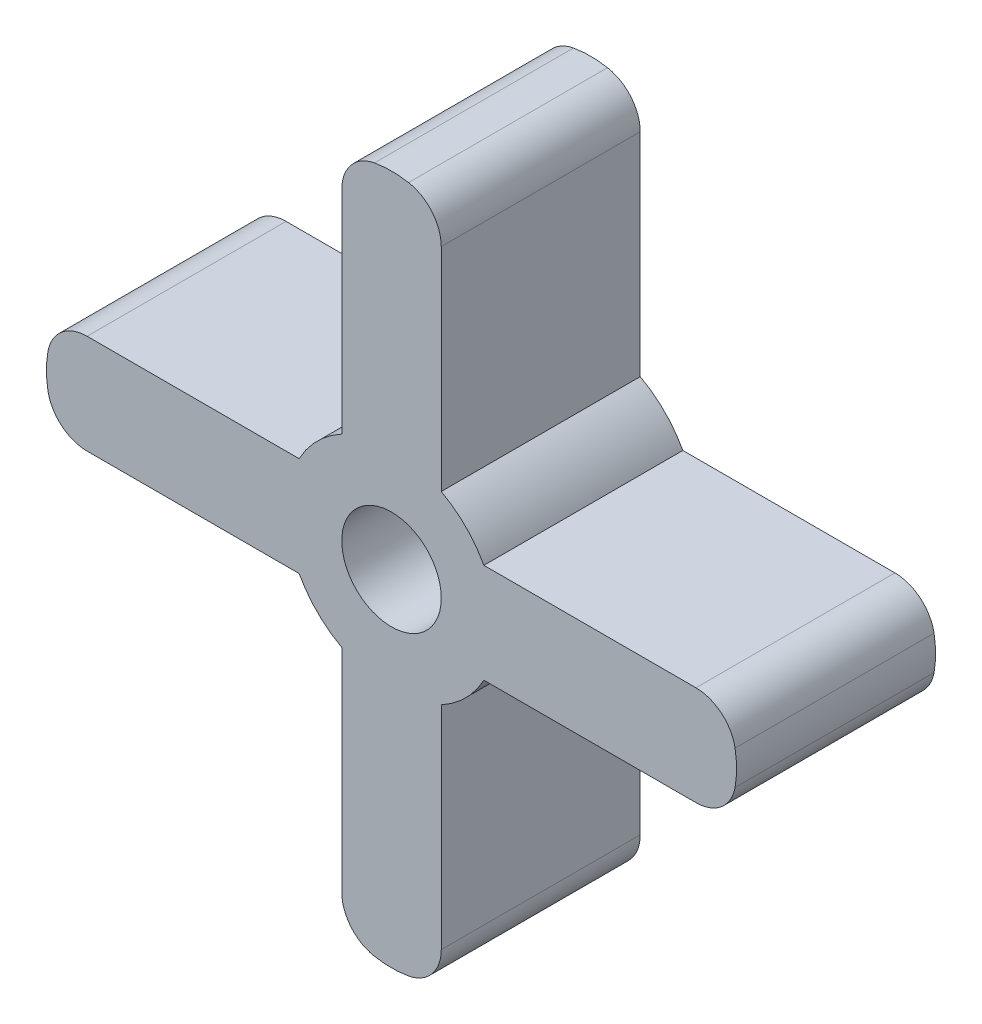
ISO-10303-21;
HEADER;
FILE_DESCRIPTION(('STEP AP214'),'2;1');
FILE_NAME('part.step','',(''),(''),'','','');
FILE_SCHEMA(('AUTOMOTIVE_DESIGN { 1 0 10303 214 1 1 1 1 }'));
ENDSEC;
DATA;
#1=APPLICATION_CONTEXT('core data for automotive mechanical design processes');
#2=APPLICATION_PROTOCOL_DEFINITION('international standard','automotive_design',2000,#1);
#3=PRODUCT_CONTEXT('',#1,'mechanical');
#4=PRODUCT('Part','Part','',(#3));
#5=PRODUCT_RELATED_PRODUCT_CATEGORY('part','',(#4));
#6=PRODUCT_DEFINITION_FORMATION('','',#4);
#7=PRODUCT_DEFINITION_CONTEXT('part definition',#1,'design');
#8=PRODUCT_DEFINITION('design','',#6,#7);
#9=PRODUCT_DEFINITION_SHAPE('','',#8);
#10=(LENGTH_UNIT() NAMED_UNIT(*) SI_UNIT(.MILLI.,.METRE.));
#11=(NAMED_UNIT(*) PLANE_ANGLE_UNIT() SI_UNIT($,.RADIAN.));
#12=(NAMED_UNIT(*) SI_UNIT($,.STERADIAN.) SOLID_ANGLE_UNIT());
#13=UNCERTAINTY_MEASURE_WITH_UNIT(LENGTH_MEASURE(1.E-05),#10,'distance_accuracy_value','');
#14=(GEOMETRIC_REPRESENTATION_CONTEXT(3) GLOBAL_UNCERTAINTY_ASSIGNED_CONTEXT((#13)) GLOBAL_UNIT_ASSIGNED_CONTEXT((#10,
#11,#12)) REPRESENTATION_CONTEXT('',''));
#15=CARTESIAN_POINT('',(0.,0.,0.));
#16=DIRECTION('',(0.,0.,1.));
#17=DIRECTION('',(1.,0.,0.));
#18=AXIS2_PLACEMENT_3D('',#15,#16,#17);
#19=CARTESIAN_POINT('',(0.,0.,10.));
#20=DIRECTION('',(0.,0.,-1.));
#21=DIRECTION('',(-1.,0.,0.));
#22=AXIS2_PLACEMENT_3D('',#19,#20,#21);
#23=CYLINDRICAL_SURFACE('',#22,5.2725158272984);
#24=CARTESIAN_POINT('',(0.,0.,0.));
#25=DIRECTION('',(0.,0.,1.));
#26=DIRECTION('',(1.,0.,0.));
#27=AXIS2_PLACEMENT_3D('',#24,#25,#26);
#28=CIRCLE('',#27,5.2725158272984);
#29=CARTESIAN_POINT('',(-2.5,4.64213562373093,0.));
#30=VERTEX_POINT('',#29);
#31=CARTESIAN_POINT('',(-4.642135623731,2.50000000000003,0.));
#32=VERTEX_POINT('',#31);
#33=EDGE_CURVE('E235',#30,#32,#28,.T.);
#34=ORIENTED_EDGE('',*,*,#33,.T.);
#35=DIRECTION('',(0.,0.,-1.));
#36=VECTOR('',#35,1.);
#37=CARTESIAN_POINT('',(-4.642135623731,2.50000000000003,10.));
#38=LINE('',#37,#36);
#39=CARTESIAN_POINT('',(-4.642135623731,2.50000000000003,10.));
#40=VERTEX_POINT('',#39);
#41=EDGE_CURVE('E215',#40,#32,#38,.T.);
#42=ORIENTED_EDGE('',*,*,#41,.F.);
#43=CARTESIAN_POINT('',(0.,0.,10.));
#44=DIRECTION('',(0.,0.,1.));
#45=DIRECTION('',(1.,0.,0.));
#46=AXIS2_PLACEMENT_3D('',#43,#44,#45);
#47=CIRCLE('',#46,5.2725158272984);
#48=CARTESIAN_POINT('',(-2.5,4.64213562373093,10.));
#49=VERTEX_POINT('',#48);
#50=EDGE_CURVE('E222',#49,#40,#47,.T.);
#51=ORIENTED_EDGE('',*,*,#50,.F.);
#52=DIRECTION('',(0.,0.,-1.));
#53=VECTOR('',#52,1.);
#54=CARTESIAN_POINT('',(-2.5,4.64213562373093,10.));
#55=LINE('',#54,#53);
#56=EDGE_CURVE('E376',#49,#30,#55,.T.);
#57=ORIENTED_EDGE('',*,*,#56,.T.);
#58=EDGE_LOOP('',(#34,#42,#51,#57));
#59=FACE_BOUND('',#58,.T.);
#60=ADVANCED_FACE('F45',(#59),#23,.T.);
#61=CARTESIAN_POINT('',(-4.642135623731,2.50000000000003,10.));
#62=DIRECTION('',(0.,-1.,0.));
#63=DIRECTION('',(1.,0.,0.));
#64=AXIS2_PLACEMENT_3D('',#61,#62,#63);
#65=PLANE('',#64);
#66=DIRECTION('',(-1.,0.,0.));
#67=VECTOR('',#66,1.);
#68=CARTESIAN_POINT('',(-4.642135623731,2.50000000000003,0.));
#69=LINE('',#68,#67);
#70=CARTESIAN_POINT('',(-15.2992730471889,2.50000000000003,0.));
#71=VERTEX_POINT('',#70);
#72=EDGE_CURVE('E478',#32,#71,#69,.T.);
#73=ORIENTED_EDGE('',*,*,#72,.T.);
#74=DIRECTION('',(0.,0.,-1.));
#75=VECTOR('',#74,1.);
#76=CARTESIAN_POINT('',(-15.2992730471889,2.50000000000003,10.));
#77=LINE('',#76,#75);
#78=CARTESIAN_POINT('',(-15.2992730471889,2.50000000000003,10.));
#79=VERTEX_POINT('',#78);
#80=EDGE_CURVE('E218',#71,#79,#77,.F.);
#81=ORIENTED_EDGE('',*,*,#80,.T.);
#82=DIRECTION('',(-1.,0.,0.));
#83=VECTOR('',#82,1.);
#84=CARTESIAN_POINT('',(-4.642135623731,2.50000000000003,10.));
#85=LINE('',#84,#83);
#86=EDGE_CURVE('E210',#40,#79,#85,.T.);
#87=ORIENTED_EDGE('',*,*,#86,.F.);
#88=ORIENTED_EDGE('',*,*,#41,.T.);
#89=EDGE_LOOP('',(#73,#81,#87,#88));
#90=FACE_BOUND('',#89,.T.);
#91=ADVANCED_FACE('F213',(#90),#65,.F.);
#92=CARTESIAN_POINT('',(-12.5423252182863,1.31373883336044E-13,10.));
#93=DIRECTION('',(0.,0.,-1.));
#94=DIRECTION('',(-1.,0.,0.));
#95=AXIS2_PLACEMENT_3D('',#92,#93,#94);
#96=CYLINDRICAL_SURFACE('',#95,4.80192100732533);
#97=CARTESIAN_POINT('',(-12.5423252182863,1.31373883336044E-13,0.));
#98=DIRECTION('',(0.,0.,1.));
#99=DIRECTION('',(-1.,0.,0.));
#100=AXIS2_PLACEMENT_3D('',#97,#98,#99);
#101=CIRCLE('',#100,4.80192100732533);
#102=CARTESIAN_POINT('',(-17.2671713724414,0.856897998689289,0.));
#103=VERTEX_POINT('',#102);
#104=CARTESIAN_POINT('',(-17.2671713724414,-0.856897998689425,0.));
#105=VERTEX_POINT('',#104);
#106=EDGE_CURVE('E481',#103,#105,#101,.T.);
#107=ORIENTED_EDGE('',*,*,#106,.T.);
#108=DIRECTION('',(0.,0.,-1.));
#109=VECTOR('',#108,1.);
#110=CARTESIAN_POINT('',(-17.2671713724414,-0.856897998689425,10.));
#111=LINE('',#110,#109);
#112=CARTESIAN_POINT('',(-17.2671713724414,-0.856897998689425,10.));
#113=VERTEX_POINT('',#112);
#114=EDGE_CURVE('E328',#105,#113,#111,.F.);
#115=ORIENTED_EDGE('',*,*,#114,.T.);
#116=CARTESIAN_POINT('',(-12.5423252182863,1.31373883336044E-13,10.));
#117=DIRECTION('',(0.,0.,1.));
#118=DIRECTION('',(-1.,0.,0.));
#119=AXIS2_PLACEMENT_3D('',#116,#117,#118);
#120=CIRCLE('',#119,4.80192100732533);
#121=CARTESIAN_POINT('',(-17.2671713724414,0.856897998689289,10.));
#122=VERTEX_POINT('',#121);
#123=EDGE_CURVE('E221',#122,#113,#120,.T.);
#124=ORIENTED_EDGE('',*,*,#123,.F.);
#125=DIRECTION('',(0.,0.,-1.));
#126=VECTOR('',#125,1.);
#127=CARTESIAN_POINT('',(-17.2671713724414,0.856897998689289,10.));
#128=LINE('',#127,#126);
#129=EDGE_CURVE('E324',#122,#103,#128,.T.);
#130=ORIENTED_EDGE('',*,*,#129,.T.);
#131=EDGE_LOOP('',(#107,#115,#124,#130));
#132=FACE_BOUND('',#131,.T.);
#133=ADVANCED_FACE('F554',(#132),#96,.T.);
#134=CARTESIAN_POINT('',(-4.642135623731,-2.49999999999998,10.));
#135=DIRECTION('',(0.,1.,0.));
#136=DIRECTION('',(-1.,0.,0.));
#137=AXIS2_PLACEMENT_3D('',#134,#135,#136);
#138=PLANE('',#137);
#139=DIRECTION('',(1.,0.,0.));
#140=VECTOR('',#139,1.);
#141=CARTESIAN_POINT('',(-4.642135623731,-2.49999999999998,10.));
#142=LINE('',#141,#140);
#143=CARTESIAN_POINT('',(-15.2992730471889,-2.5,10.));
#144=VERTEX_POINT('',#143);
#145=CARTESIAN_POINT('',(-4.64213562373101,-2.49999999999998,10.));
#146=VERTEX_POINT('',#145);
#147=EDGE_CURVE('E493',#144,#146,#142,.T.);
#148=ORIENTED_EDGE('',*,*,#147,.F.);
#149=DIRECTION('',(0.,0.,-1.));
#150=VECTOR('',#149,1.);
#151=CARTESIAN_POINT('',(-15.2992730471889,-2.5,10.));
#152=LINE('',#151,#150);
#153=CARTESIAN_POINT('',(-15.2992730471889,-2.5,0.));
#154=VERTEX_POINT('',#153);
#155=EDGE_CURVE('E320',#144,#154,#152,.T.);
#156=ORIENTED_EDGE('',*,*,#155,.T.);
#157=DIRECTION('',(1.,0.,0.));
#158=VECTOR('',#157,1.);
#159=CARTESIAN_POINT('',(-4.642135623731,-2.49999999999998,0.));
#160=LINE('',#159,#158);
#161=CARTESIAN_POINT('',(-4.64213562373101,-2.49999999999998,0.));
#162=VERTEX_POINT('',#161);
#163=EDGE_CURVE('E419',#154,#162,#160,.T.);
#164=ORIENTED_EDGE('',*,*,#163,.T.);
#165=DIRECTION('',(0.,0.,-1.));
#166=VECTOR('',#165,1.);
#167=CARTESIAN_POINT('',(-4.64213562373101,-2.49999999999998,10.));
#168=LINE('',#167,#166);
#169=EDGE_CURVE('E238',#146,#162,#168,.T.);
#170=ORIENTED_EDGE('',*,*,#169,.F.);
#171=EDGE_LOOP('',(#148,#156,#164,#170));
#172=FACE_BOUND('',#171,.T.);
#173=ADVANCED_FACE('F488',(#172),#138,.F.);
#174=CARTESIAN_POINT('',(0.,0.,10.));
#175=DIRECTION('',(0.,0.,-1.));
#176=DIRECTION('',(-1.,0.,0.));
#177=AXIS2_PLACEMENT_3D('',#174,#175,#176);
#178=CYLINDRICAL_SURFACE('',#177,5.27251582729843);
#179=CARTESIAN_POINT('',(0.,0.,0.));
#180=DIRECTION('',(0.,0.,1.));
#181=DIRECTION('',(1.,0.,0.));
#182=AXIS2_PLACEMENT_3D('',#179,#180,#181);
#183=CIRCLE('',#182,5.27251582729843);
#184=CARTESIAN_POINT('',(-2.50000000000009,-4.64213562373097,0.));
#185=VERTEX_POINT('',#184);
#186=EDGE_CURVE('E409',#162,#185,#183,.T.);
#187=ORIENTED_EDGE('',*,*,#186,.T.);
#188=DIRECTION('',(0.,0.,-1.));
#189=VECTOR('',#188,1.);
#190=CARTESIAN_POINT('',(-2.50000000000009,-4.64213562373097,10.));
#191=LINE('',#190,#189);
#192=CARTESIAN_POINT('',(-2.50000000000009,-4.64213562373097,10.));
#193=VERTEX_POINT('',#192);
#194=EDGE_CURVE('E246',#193,#185,#191,.T.);
#195=ORIENTED_EDGE('',*,*,#194,.F.);
#196=CARTESIAN_POINT('',(0.,0.,10.));
#197=DIRECTION('',(0.,0.,1.));
#198=DIRECTION('',(1.,0.,0.));
#199=AXIS2_PLACEMENT_3D('',#196,#197,#198);
#200=CIRCLE('',#199,5.27251582729843);
#201=EDGE_CURVE('E491',#146,#193,#200,.T.);
#202=ORIENTED_EDGE('',*,*,#201,.F.);
#203=ORIENTED_EDGE('',*,*,#169,.T.);
#204=EDGE_LOOP('',(#187,#195,#202,#203));
#205=FACE_BOUND('',#204,.T.);
#206=ADVANCED_FACE('F490',(#205),#178,.T.);
#207=CARTESIAN_POINT('',(-2.50000000000009,-4.64213562373097,10.));
#208=DIRECTION('',(1.,0.,0.));
#209=DIRECTION('',(0.,1.,0.));
#210=AXIS2_PLACEMENT_3D('',#207,#208,#209);
#211=PLANE('',#210);
#212=DIRECTION('',(0.,-1.,0.));
#213=VECTOR('',#212,1.);
#214=CARTESIAN_POINT('',(-2.50000000000009,-4.64213562373097,0.));
#215=LINE('',#214,#213);
#216=CARTESIAN_POINT('',(-2.50000000000009,-15.2992730471889,0.));
#217=VERTEX_POINT('',#216);
#218=EDGE_CURVE('E401',#185,#217,#215,.T.);
#219=ORIENTED_EDGE('',*,*,#218,.T.);
#220=DIRECTION('',(0.,0.,-1.));
#221=VECTOR('',#220,1.);
#222=CARTESIAN_POINT('',(-2.50000000000009,-15.2992730471889,10.));
#223=LINE('',#222,#221);
#224=CARTESIAN_POINT('',(-2.50000000000009,-15.2992730471889,10.));
#225=VERTEX_POINT('',#224);
#226=EDGE_CURVE('E317',#217,#225,#223,.F.);
#227=ORIENTED_EDGE('',*,*,#226,.T.);
#228=DIRECTION('',(0.,-1.,0.));
#229=VECTOR('',#228,1.);
#230=CARTESIAN_POINT('',(-2.50000000000009,-4.64213562373097,10.));
#231=LINE('',#230,#229);
#232=EDGE_CURVE('E404',#193,#225,#231,.T.);
#233=ORIENTED_EDGE('',*,*,#232,.F.);
#234=ORIENTED_EDGE('',*,*,#194,.T.);
#235=EDGE_LOOP('',(#219,#227,#233,#234));
#236=FACE_BOUND('',#235,.T.);
#237=ADVANCED_FACE('F400',(#236),#211,.F.);
#238=CARTESIAN_POINT('',(0.,-12.5423252182863,10.));
#239=DIRECTION('',(0.,0.,-1.));
#240=DIRECTION('',(-1.,0.,0.));
#241=AXIS2_PLACEMENT_3D('',#238,#239,#240);
#242=CYLINDRICAL_SURFACE('',#241,4.80192100732534);
#243=CARTESIAN_POINT('',(0.,-12.5423252182863,0.));
#244=DIRECTION('',(0.,0.,1.));
#245=DIRECTION('',(-1.,0.,0.));
#246=AXIS2_PLACEMENT_3D('',#243,#244,#245);
#247=CIRCLE('',#246,4.80192100732534);
#248=CARTESIAN_POINT('',(-0.856897998689415,-17.2671713724414,0.));
#249=VERTEX_POINT('',#248);
#250=CARTESIAN_POINT('',(0.856897998689379,-17.2671713724414,0.));
#251=VERTEX_POINT('',#250);
#252=EDGE_CURVE('E412',#249,#251,#247,.T.);
#253=ORIENTED_EDGE('',*,*,#252,.T.);
#254=DIRECTION('',(0.,0.,-1.));
#255=VECTOR('',#254,1.);
#256=CARTESIAN_POINT('',(0.856897998689379,-17.2671713724414,10.));
#257=LINE('',#256,#255);
#258=CARTESIAN_POINT('',(0.856897998689379,-17.2671713724414,10.));
#259=VERTEX_POINT('',#258);
#260=EDGE_CURVE('E314',#251,#259,#257,.F.);
#261=ORIENTED_EDGE('',*,*,#260,.T.);
#262=CARTESIAN_POINT('',(0.,-12.5423252182863,10.));
#263=DIRECTION('',(0.,0.,1.));
#264=DIRECTION('',(-1.,0.,0.));
#265=AXIS2_PLACEMENT_3D('',#262,#263,#264);
#266=CIRCLE('',#265,4.80192100732534);
#267=CARTESIAN_POINT('',(-0.856897998689415,-17.2671713724414,10.));
#268=VERTEX_POINT('',#267);
#269=EDGE_CURVE('E497',#268,#259,#266,.T.);
#270=ORIENTED_EDGE('',*,*,#269,.F.);
#271=DIRECTION('',(0.,0.,-1.));
#272=VECTOR('',#271,1.);
#273=CARTESIAN_POINT('',(-0.856897998689415,-17.2671713724414,10.));
#274=LINE('',#273,#272);
#275=EDGE_CURVE('E310',#268,#249,#274,.T.);
#276=ORIENTED_EDGE('',*,*,#275,.T.);
#277=EDGE_LOOP('',(#253,#261,#270,#276));
#278=FACE_BOUND('',#277,.T.);
#279=ADVANCED_FACE('F532',(#278),#242,.T.);
#280=CARTESIAN_POINT('',(2.49999999999991,-4.64213562373097,10.));
#281=DIRECTION('',(-1.,0.,0.));
#282=DIRECTION('',(0.,-1.,0.));
#283=AXIS2_PLACEMENT_3D('',#280,#281,#282);
#284=PLANE('',#283);
#285=DIRECTION('',(0.,1.,0.));
#286=VECTOR('',#285,1.);
#287=CARTESIAN_POINT('',(2.49999999999991,-4.64213562373097,10.));
#288=LINE('',#287,#286);
#289=CARTESIAN_POINT('',(2.49999999999999,-15.2992730471889,10.));
#290=VERTEX_POINT('',#289);
#291=CARTESIAN_POINT('',(2.49999999999991,-4.64213562373098,10.));
#292=VERTEX_POINT('',#291);
#293=EDGE_CURVE('E505',#290,#292,#288,.T.);
#294=ORIENTED_EDGE('',*,*,#293,.F.);
#295=DIRECTION('',(0.,0.,-1.));
#296=VECTOR('',#295,1.);
#297=CARTESIAN_POINT('',(2.49999999999999,-15.2992730471889,10.));
#298=LINE('',#297,#296);
#299=CARTESIAN_POINT('',(2.49999999999999,-15.2992730471889,0.));
#300=VERTEX_POINT('',#299);
#301=EDGE_CURVE('E306',#290,#300,#298,.T.);
#302=ORIENTED_EDGE('',*,*,#301,.T.);
#303=DIRECTION('',(0.,1.,0.));
#304=VECTOR('',#303,1.);
#305=CARTESIAN_POINT('',(2.49999999999991,-4.64213562373097,0.));
#306=LINE('',#305,#304);
#307=CARTESIAN_POINT('',(2.49999999999991,-4.64213562373098,0.));
#308=VERTEX_POINT('',#307);
#309=EDGE_CURVE('E417',#300,#308,#306,.T.);
#310=ORIENTED_EDGE('',*,*,#309,.T.);
#311=DIRECTION('',(0.,0.,-1.));
#312=VECTOR('',#311,1.);
#313=CARTESIAN_POINT('',(2.49999999999991,-4.64213562373098,10.));
#314=LINE('',#313,#312);
#315=EDGE_CURVE('E390',#292,#308,#314,.T.);
#316=ORIENTED_EDGE('',*,*,#315,.F.);
#317=EDGE_LOOP('',(#294,#302,#310,#316));
#318=FACE_BOUND('',#317,.T.);
#319=ADVANCED_FACE('F524',(#318),#284,.F.);
#320=CARTESIAN_POINT('',(0.,0.,10.));
#321=DIRECTION('',(0.,0.,-1.));
#322=DIRECTION('',(-1.,0.,0.));
#323=AXIS2_PLACEMENT_3D('',#320,#321,#322);
#324=CYLINDRICAL_SURFACE('',#323,5.27251582729837);
#325=CARTESIAN_POINT('',(0.,0.,0.));
#326=DIRECTION('',(0.,0.,1.));
#327=DIRECTION('',(1.,0.,0.));
#328=AXIS2_PLACEMENT_3D('',#325,#326,#327);
#329=CIRCLE('',#328,5.27251582729837);
#330=CARTESIAN_POINT('',(4.64213562373091,-2.50000000000007,0.));
#331=VERTEX_POINT('',#330);
#332=EDGE_CURVE('E425',#308,#331,#329,.T.);
#333=ORIENTED_EDGE('',*,*,#332,.T.);
#334=DIRECTION('',(0.,0.,-1.));
#335=VECTOR('',#334,1.);
#336=CARTESIAN_POINT('',(4.64213562373091,-2.50000000000007,10.));
#337=LINE('',#336,#335);
#338=CARTESIAN_POINT('',(4.64213562373091,-2.50000000000007,10.));
#339=VERTEX_POINT('',#338);
#340=EDGE_CURVE('E386',#339,#331,#337,.T.);
#341=ORIENTED_EDGE('',*,*,#340,.F.);
#342=CARTESIAN_POINT('',(0.,0.,10.));
#343=DIRECTION('',(0.,0.,1.));
#344=DIRECTION('',(1.,0.,0.));
#345=AXIS2_PLACEMENT_3D('',#342,#343,#344);
#346=CIRCLE('',#345,5.27251582729837);
#347=EDGE_CURVE('E466',#292,#339,#346,.T.);
#348=ORIENTED_EDGE('',*,*,#347,.F.);
#349=ORIENTED_EDGE('',*,*,#315,.T.);
#350=EDGE_LOOP('',(#333,#341,#348,#349));
#351=FACE_BOUND('',#350,.T.);
#352=ADVANCED_FACE('F514',(#351),#324,.T.);
#353=CARTESIAN_POINT('',(4.64213562373091,-2.50000000000007,10.));
#354=DIRECTION('',(0.,1.,0.));
#355=DIRECTION('',(-1.,0.,0.));
#356=AXIS2_PLACEMENT_3D('',#353,#354,#355);
#357=PLANE('',#356);
#358=DIRECTION('',(1.,0.,0.));
#359=VECTOR('',#358,1.);
#360=CARTESIAN_POINT('',(4.64213562373091,-2.50000000000007,0.));
#361=LINE('',#360,#359);
#362=CARTESIAN_POINT('',(15.2992730471887,-2.49999999999998,0.));
#363=VERTEX_POINT('',#362);
#364=EDGE_CURVE('E428',#331,#363,#361,.T.);
#365=ORIENTED_EDGE('',*,*,#364,.T.);
#366=DIRECTION('',(0.,0.,-1.));
#367=VECTOR('',#366,1.);
#368=CARTESIAN_POINT('',(15.2992730471887,-2.49999999999998,10.));
#369=LINE('',#368,#367);
#370=CARTESIAN_POINT('',(15.2992730471887,-2.49999999999998,10.));
#371=VERTEX_POINT('',#370);
#372=EDGE_CURVE('E303',#363,#371,#369,.F.);
#373=ORIENTED_EDGE('',*,*,#372,.T.);
#374=DIRECTION('',(1.,0.,0.));
#375=VECTOR('',#374,1.);
#376=CARTESIAN_POINT('',(4.64213562373091,-2.50000000000007,10.));
#377=LINE('',#376,#375);
#378=EDGE_CURVE('E461',#339,#371,#377,.T.);
#379=ORIENTED_EDGE('',*,*,#378,.F.);
#380=ORIENTED_EDGE('',*,*,#340,.T.);
#381=EDGE_LOOP('',(#365,#373,#379,#380));
#382=FACE_BOUND('',#381,.T.);
#383=ADVANCED_FACE('F518',(#382),#357,.F.);
#384=CARTESIAN_POINT('',(12.5423252182863,0.,10.));
#385=DIRECTION('',(0.,0.,-1.));
#386=DIRECTION('',(-1.,0.,0.));
#387=AXIS2_PLACEMENT_3D('',#384,#385,#386);
#388=CYLINDRICAL_SURFACE('',#387,4.80192100732513);
#389=CARTESIAN_POINT('',(12.5423252182863,0.,0.));
#390=DIRECTION('',(0.,0.,1.));
#391=DIRECTION('',(-1.,0.,0.));
#392=AXIS2_PLACEMENT_3D('',#389,#390,#391);
#393=CIRCLE('',#392,4.80192100732513);
#394=CARTESIAN_POINT('',(17.2671713724412,-0.856897998689282,0.));
#395=VERTEX_POINT('',#394);
#396=CARTESIAN_POINT('',(17.2671713724413,0.856897998688818,0.));
#397=VERTEX_POINT('',#396);
#398=EDGE_CURVE('E432',#395,#397,#393,.T.);
#399=ORIENTED_EDGE('',*,*,#398,.T.);
#400=DIRECTION('',(0.,0.,-1.));
#401=VECTOR('',#400,1.);
#402=CARTESIAN_POINT('',(17.2671713724413,0.856897998688819,10.));
#403=LINE('',#402,#401);
#404=CARTESIAN_POINT('',(17.2671713724413,0.856897998688818,10.));
#405=VERTEX_POINT('',#404);
#406=EDGE_CURVE('E277',#397,#405,#403,.F.);
#407=ORIENTED_EDGE('',*,*,#406,.T.);
#408=CARTESIAN_POINT('',(12.5423252182863,0.,10.));
#409=DIRECTION('',(0.,0.,1.));
#410=DIRECTION('',(-1.,0.,0.));
#411=AXIS2_PLACEMENT_3D('',#408,#409,#410);
#412=CIRCLE('',#411,4.80192100732513);
#413=CARTESIAN_POINT('',(17.2671713724412,-0.856897998689282,10.));
#414=VERTEX_POINT('',#413);
#415=EDGE_CURVE('E456',#414,#405,#412,.T.);
#416=ORIENTED_EDGE('',*,*,#415,.F.);
#417=DIRECTION('',(0.,0.,-1.));
#418=VECTOR('',#417,1.);
#419=CARTESIAN_POINT('',(17.2671713724412,-0.856897998689282,10.));
#420=LINE('',#419,#418);
#421=EDGE_CURVE('E273',#414,#395,#420,.T.);
#422=ORIENTED_EDGE('',*,*,#421,.T.);
#423=EDGE_LOOP('',(#399,#407,#416,#422));
#424=FACE_BOUND('',#423,.T.);
#425=ADVANCED_FACE('F455',(#424),#388,.T.);
#426=CARTESIAN_POINT('',(4.64213562373091,2.49999999999993,10.));
#427=DIRECTION('',(0.,-1.,0.));
#428=DIRECTION('',(1.,0.,0.));
#429=AXIS2_PLACEMENT_3D('',#426,#427,#428);
#430=PLANE('',#429);
#431=DIRECTION('',(-1.,0.,0.));
#432=VECTOR('',#431,1.);
#433=CARTESIAN_POINT('',(4.64213562373091,2.49999999999993,10.));
#434=LINE('',#433,#432);
#435=CARTESIAN_POINT('',(15.2992730471888,2.49999999999967,10.));
#436=VERTEX_POINT('',#435);
#437=CARTESIAN_POINT('',(4.64213562373093,2.49999999999995,10.));
#438=VERTEX_POINT('',#437);
#439=EDGE_CURVE('E448',#436,#438,#434,.T.);
#440=ORIENTED_EDGE('',*,*,#439,.F.);
#441=DIRECTION('',(0.,0.,-1.));
#442=VECTOR('',#441,1.);
#443=CARTESIAN_POINT('',(15.2992730471888,2.49999999999967,10.));
#444=LINE('',#443,#442);
#445=CARTESIAN_POINT('',(15.2992730471888,2.49999999999967,0.));
#446=VERTEX_POINT('',#445);
#447=EDGE_CURVE('E237',#436,#446,#444,.T.);
#448=ORIENTED_EDGE('',*,*,#447,.T.);
#449=DIRECTION('',(-1.,0.,0.));
#450=VECTOR('',#449,1.);
#451=CARTESIAN_POINT('',(4.64213562373091,2.49999999999993,0.));
#452=LINE('',#451,#450);
#453=CARTESIAN_POINT('',(4.64213562373093,2.49999999999995,0.));
#454=VERTEX_POINT('',#453);
#455=EDGE_CURVE('E436',#446,#454,#452,.T.);
#456=ORIENTED_EDGE('',*,*,#455,.T.);
#457=DIRECTION('',(0.,0.,-1.));
#458=VECTOR('',#457,1.);
#459=CARTESIAN_POINT('',(4.64213562373093,2.49999999999995,10.));
#460=LINE('',#459,#458);
#461=EDGE_CURVE('E382',#438,#454,#460,.T.);
#462=ORIENTED_EDGE('',*,*,#461,.F.);
#463=EDGE_LOOP('',(#440,#448,#456,#462));
#464=FACE_BOUND('',#463,.T.);
#465=ADVANCED_FACE('F446',(#464),#430,.F.);
#466=CARTESIAN_POINT('',(0.,0.,10.));
#467=DIRECTION('',(0.,0.,-1.));
#468=DIRECTION('',(-1.,0.,0.));
#469=AXIS2_PLACEMENT_3D('',#466,#467,#468);
#470=CYLINDRICAL_SURFACE('',#469,5.27251582729834);
#471=CARTESIAN_POINT('',(0.,0.,0.));
#472=DIRECTION('',(0.,0.,1.));
#473=DIRECTION('',(1.,0.,0.));
#474=AXIS2_PLACEMENT_3D('',#471,#472,#473);
#475=CIRCLE('',#474,5.27251582729834);
#476=CARTESIAN_POINT('',(2.5,4.64213562373093,0.));
#477=VERTEX_POINT('',#476);
#478=EDGE_CURVE('E372',#454,#477,#475,.T.);
#479=ORIENTED_EDGE('',*,*,#478,.T.);
#480=DIRECTION('',(0.,0.,-1.));
#481=VECTOR('',#480,1.);
#482=CARTESIAN_POINT('',(2.5,4.64213562373093,10.));
#483=LINE('',#482,#481);
#484=CARTESIAN_POINT('',(2.5,4.64213562373093,10.));
#485=VERTEX_POINT('',#484);
#486=EDGE_CURVE('E379',#485,#477,#483,.T.);
#487=ORIENTED_EDGE('',*,*,#486,.F.);
#488=CARTESIAN_POINT('',(0.,0.,10.));
#489=DIRECTION('',(0.,0.,1.));
#490=DIRECTION('',(1.,0.,0.));
#491=AXIS2_PLACEMENT_3D('',#488,#489,#490);
#492=CIRCLE('',#491,5.27251582729834);
#493=EDGE_CURVE('E353',#438,#485,#492,.T.);
#494=ORIENTED_EDGE('',*,*,#493,.F.);
#495=ORIENTED_EDGE('',*,*,#461,.T.);
#496=EDGE_LOOP('',(#479,#487,#494,#495));
#497=FACE_BOUND('',#496,.T.);
#498=ADVANCED_FACE('F441',(#497),#470,.T.);
#499=CARTESIAN_POINT('',(2.5,4.64213562373093,10.));
#500=DIRECTION('',(-1.,0.,0.));
#501=DIRECTION('',(0.,-1.,0.));
#502=AXIS2_PLACEMENT_3D('',#499,#500,#501);
#503=PLANE('',#502);
#504=DIRECTION('',(0.,1.,0.));
#505=VECTOR('',#504,1.);
#506=CARTESIAN_POINT('',(2.5,4.64213562373093,0.));
#507=LINE('',#506,#505);
#508=CARTESIAN_POINT('',(2.49999999999982,15.2992730471888,0.));
#509=VERTEX_POINT('',#508);
#510=EDGE_CURVE('E349',#477,#509,#507,.T.);
#511=ORIENTED_EDGE('',*,*,#510,.T.);
#512=DIRECTION('',(0.,0.,-1.));
#513=VECTOR('',#512,1.);
#514=CARTESIAN_POINT('',(2.49999999999982,15.2992730471888,10.));
#515=LINE('',#514,#513);
#516=CARTESIAN_POINT('',(2.49999999999982,15.2992730471888,10.));
#517=VERTEX_POINT('',#516);
#518=EDGE_CURVE('E55',#509,#517,#515,.F.);
#519=ORIENTED_EDGE('',*,*,#518,.T.);
#520=DIRECTION('',(0.,1.,0.));
#521=VECTOR('',#520,1.);
#522=CARTESIAN_POINT('',(2.5,4.64213562373093,10.));
#523=LINE('',#522,#521);
#524=EDGE_CURVE('E347',#485,#517,#523,.T.);
#525=ORIENTED_EDGE('',*,*,#524,.F.);
#526=ORIENTED_EDGE('',*,*,#486,.T.);
#527=EDGE_LOOP('',(#511,#519,#525,#526));
#528=FACE_BOUND('',#527,.T.);
#529=ADVANCED_FACE('F345',(#528),#503,.F.);
#530=CARTESIAN_POINT('',(0.,12.5423252182863,10.));
#531=DIRECTION('',(0.,0.,-1.));
#532=DIRECTION('',(-1.,0.,0.));
#533=AXIS2_PLACEMENT_3D('',#530,#531,#532);
#534=CYLINDRICAL_SURFACE('',#533,4.80192100732516);
#535=CARTESIAN_POINT('',(0.,12.5423252182863,10.));
#536=DIRECTION('',(0.,0.,1.));
#537=DIRECTION('',(-1.,0.,0.));
#538=AXIS2_PLACEMENT_3D('',#535,#536,#537);
#539=CIRCLE('',#538,4.80192100732516);
#540=CARTESIAN_POINT('',(0.856897998689048,17.2671713724413,10.));
#541=VERTEX_POINT('',#540);
#542=CARTESIAN_POINT('',(-0.856897998689046,17.2671713724413,10.));
#543=VERTEX_POINT('',#542);
#544=EDGE_CURVE('E356',#541,#543,#539,.T.);
#545=ORIENTED_EDGE('',*,*,#544,.F.);
#546=DIRECTION('',(0.,0.,-1.));
#547=VECTOR('',#546,1.);
#548=CARTESIAN_POINT('',(0.856897998689048,17.2671713724413,10.));
#549=LINE('',#548,#547);
#550=CARTESIAN_POINT('',(0.856897998689048,17.2671713724413,0.));
#551=VERTEX_POINT('',#550);
#552=EDGE_CURVE('E335',#541,#551,#549,.T.);
#553=ORIENTED_EDGE('',*,*,#552,.T.);
#554=CARTESIAN_POINT('',(0.,12.5423252182863,0.));
#555=DIRECTION('',(0.,0.,1.));
#556=DIRECTION('',(-1.,0.,0.));
#557=AXIS2_PLACEMENT_3D('',#554,#555,#556);
#558=CIRCLE('',#557,4.80192100732516);
#559=CARTESIAN_POINT('',(-0.856897998689046,17.2671713724413,0.));
#560=VERTEX_POINT('',#559);
#561=EDGE_CURVE('E362',#551,#560,#558,.T.);
#562=ORIENTED_EDGE('',*,*,#561,.T.);
#563=DIRECTION('',(0.,0.,-1.));
#564=VECTOR('',#563,1.);
#565=CARTESIAN_POINT('',(-0.856897998689046,17.2671713724413,10.));
#566=LINE('',#565,#564);
#567=EDGE_CURVE('E70',#560,#543,#566,.F.);
#568=ORIENTED_EDGE('',*,*,#567,.T.);
#569=EDGE_LOOP('',(#545,#553,#562,#568));
#570=FACE_BOUND('',#569,.T.);
#571=ADVANCED_FACE('F361',(#570),#534,.T.);
#572=CARTESIAN_POINT('',(-2.5,4.64213562373093,10.));
#573=DIRECTION('',(1.,0.,0.));
#574=DIRECTION('',(0.,1.,0.));
#575=AXIS2_PLACEMENT_3D('',#572,#573,#574);
#576=PLANE('',#575);
#577=DIRECTION('',(0.,-1.,0.));
#578=VECTOR('',#577,1.);
#579=CARTESIAN_POINT('',(-2.5,4.64213562373093,10.));
#580=LINE('',#579,#578);
#581=CARTESIAN_POINT('',(-2.49999999999982,15.2992730471888,10.));
#582=VERTEX_POINT('',#581);
#583=EDGE_CURVE('E227',#582,#49,#580,.T.);
#584=ORIENTED_EDGE('',*,*,#583,.F.);
#585=DIRECTION('',(0.,0.,-1.));
#586=VECTOR('',#585,1.);
#587=CARTESIAN_POINT('',(-2.49999999999982,15.2992730471888,10.));
#588=LINE('',#587,#586);
#589=CARTESIAN_POINT('',(-2.49999999999982,15.2992730471888,0.));
#590=VERTEX_POINT('',#589);
#591=EDGE_CURVE('E11',#582,#590,#588,.T.);
#592=ORIENTED_EDGE('',*,*,#591,.T.);
#593=DIRECTION('',(0.,-1.,0.));
#594=VECTOR('',#593,1.);
#595=CARTESIAN_POINT('',(-2.5,4.64213562373093,0.));
#596=LINE('',#595,#594);
#597=EDGE_CURVE('E232',#590,#30,#596,.T.);
#598=ORIENTED_EDGE('',*,*,#597,.T.);
#599=ORIENTED_EDGE('',*,*,#56,.F.);
#600=EDGE_LOOP('',(#584,#592,#598,#599));
#601=FACE_BOUND('',#600,.T.);
#602=ADVANCED_FACE('F630',(#601),#576,.F.);
#603=CARTESIAN_POINT('',(0.,0.,10.));
#604=DIRECTION('',(0.,0.,1.));
#605=DIRECTION('',(1.,0.,0.));
#606=AXIS2_PLACEMENT_3D('',#603,#604,#605);
#607=PLANE('',#606);
#608=CARTESIAN_POINT('',(0.,0.,10.));
#609=DIRECTION('',(0.,0.,1.));
#610=DIRECTION('',(1.,0.,0.));
#611=AXIS2_PLACEMENT_3D('',#608,#609,#610);
#612=CIRCLE('',#611,2.5);
#613=CARTESIAN_POINT('',(2.5,0.,10.));
#614=VERTEX_POINT('',#613);
#615=EDGE_CURVE('E766',#614,#614,#612,.T.);
#616=ORIENTED_EDGE('',*,*,#615,.F.);
#617=EDGE_LOOP('',(#616));
#618=FACE_BOUND('',#617,.T.);
#619=ORIENTED_EDGE('',*,*,#415,.T.);
#620=CARTESIAN_POINT('',(15.2992730471888,0.499999999999669,10.));
#621=DIRECTION('',(0.,0.,1.));
#622=DIRECTION('',(1.,0.,0.));
#623=AXIS2_PLACEMENT_3D('',#620,#621,#622);
#624=CIRCLE('',#623,2.);
#625=EDGE_CURVE('E300',#405,#436,#624,.T.);
#626=ORIENTED_EDGE('',*,*,#625,.T.);
#627=ORIENTED_EDGE('',*,*,#439,.T.);
#628=ORIENTED_EDGE('',*,*,#493,.T.);
#629=ORIENTED_EDGE('',*,*,#524,.T.);
#630=CARTESIAN_POINT('',(0.499999999999823,15.2992730471888,10.));
#631=DIRECTION('',(0.,0.,1.));
#632=DIRECTION('',(1.,0.,0.));
#633=AXIS2_PLACEMENT_3D('',#630,#631,#632);
#634=CIRCLE('',#633,2.);
#635=EDGE_CURVE('E282',#517,#541,#634,.T.);
#636=ORIENTED_EDGE('',*,*,#635,.T.);
#637=ORIENTED_EDGE('',*,*,#544,.T.);
#638=CARTESIAN_POINT('',(-0.499999999999822,15.2992730471888,10.));
#639=DIRECTION('',(0.,0.,1.));
#640=DIRECTION('',(1.,0.,0.));
#641=AXIS2_PLACEMENT_3D('',#638,#639,#640);
#642=CIRCLE('',#641,2.);
#643=EDGE_CURVE('E62',#543,#582,#642,.T.);
#644=ORIENTED_EDGE('',*,*,#643,.T.);
#645=ORIENTED_EDGE('',*,*,#583,.T.);
#646=ORIENTED_EDGE('',*,*,#50,.T.);
#647=ORIENTED_EDGE('',*,*,#86,.T.);
#648=CARTESIAN_POINT('',(-15.2992730471889,0.500000000000031,10.));
#649=DIRECTION('',(0.,0.,1.));
#650=DIRECTION('',(1.,0.,0.));
#651=AXIS2_PLACEMENT_3D('',#648,#649,#650);
#652=CIRCLE('',#651,2.);
#653=EDGE_CURVE('E285',#79,#122,#652,.T.);
#654=ORIENTED_EDGE('',*,*,#653,.T.);
#655=ORIENTED_EDGE('',*,*,#123,.T.);
#656=CARTESIAN_POINT('',(-15.2992730471889,-0.500000000000001,10.));
#657=DIRECTION('',(0.,0.,1.));
#658=DIRECTION('',(1.,0.,0.));
#659=AXIS2_PLACEMENT_3D('',#656,#657,#658);
#660=CIRCLE('',#659,2.);
#661=EDGE_CURVE('E288',#113,#144,#660,.T.);
#662=ORIENTED_EDGE('',*,*,#661,.T.);
#663=ORIENTED_EDGE('',*,*,#147,.T.);
#664=ORIENTED_EDGE('',*,*,#201,.T.);
#665=ORIENTED_EDGE('',*,*,#232,.T.);
#666=CARTESIAN_POINT('',(-0.500000000000086,-15.2992730471889,10.));
#667=DIRECTION('',(0.,0.,1.));
#668=DIRECTION('',(1.,0.,0.));
#669=AXIS2_PLACEMENT_3D('',#666,#667,#668);
#670=CIRCLE('',#669,2.);
#671=EDGE_CURVE('E291',#225,#268,#670,.T.);
#672=ORIENTED_EDGE('',*,*,#671,.T.);
#673=ORIENTED_EDGE('',*,*,#269,.T.);
#674=CARTESIAN_POINT('',(0.499999999999993,-15.2992730471889,10.));
#675=DIRECTION('',(0.,0.,1.));
#676=DIRECTION('',(1.,0.,0.));
#677=AXIS2_PLACEMENT_3D('',#674,#675,#676);
#678=CIRCLE('',#677,2.);
#679=EDGE_CURVE('E294',#259,#290,#678,.T.);
#680=ORIENTED_EDGE('',*,*,#679,.T.);
#681=ORIENTED_EDGE('',*,*,#293,.T.);
#682=ORIENTED_EDGE('',*,*,#347,.T.);
#683=ORIENTED_EDGE('',*,*,#378,.T.);
#684=CARTESIAN_POINT('',(15.2992730471887,-0.499999999999976,10.));
#685=DIRECTION('',(0.,0.,1.));
#686=DIRECTION('',(1.,0.,0.));
#687=AXIS2_PLACEMENT_3D('',#684,#685,#686);
#688=CIRCLE('',#687,2.);
#689=EDGE_CURVE('E297',#371,#414,#688,.T.);
#690=ORIENTED_EDGE('',*,*,#689,.T.);
#691=EDGE_LOOP('',(#619,#626,#627,#628,#629,#636,#637,#644,#645,#646,#647,#654,#655,#662,#663,
#664,#665,#672,#673,#680,#681,#682,#683,#690));
#692=FACE_BOUND('',#691,.T.);
#693=ADVANCED_FACE('F226',(#618,#692),#607,.T.);
#694=CARTESIAN_POINT('',(0.,0.,0.));
#695=DIRECTION('',(0.,0.,1.));
#696=DIRECTION('',(1.,0.,0.));
#697=AXIS2_PLACEMENT_3D('',#694,#695,#696);
#698=PLANE('',#697);
#699=CARTESIAN_POINT('',(0.,0.,0.));
#700=DIRECTION('',(0.,0.,1.));
#701=DIRECTION('',(1.,0.,0.));
#702=AXIS2_PLACEMENT_3D('',#699,#700,#701);
#703=CIRCLE('',#702,2.5);
#704=CARTESIAN_POINT('',(2.5,0.,0.));
#705=VERTEX_POINT('',#704);
#706=EDGE_CURVE('E49',#705,#705,#703,.F.);
#707=ORIENTED_EDGE('',*,*,#706,.F.);
#708=EDGE_LOOP('',(#707));
#709=FACE_BOUND('',#708,.T.);
#710=ORIENTED_EDGE('',*,*,#455,.F.);
#711=CARTESIAN_POINT('',(15.2992730471888,0.499999999999669,0.));
#712=DIRECTION('',(0.,0.,1.));
#713=DIRECTION('',(1.,0.,0.));
#714=AXIS2_PLACEMENT_3D('',#711,#712,#713);
#715=CIRCLE('',#714,2.);
#716=EDGE_CURVE('E270',#446,#397,#715,.F.);
#717=ORIENTED_EDGE('',*,*,#716,.T.);
#718=ORIENTED_EDGE('',*,*,#398,.F.);
#719=CARTESIAN_POINT('',(15.2992730471887,-0.499999999999976,0.));
#720=DIRECTION('',(0.,0.,1.));
#721=DIRECTION('',(1.,0.,0.));
#722=AXIS2_PLACEMENT_3D('',#719,#720,#721);
#723=CIRCLE('',#722,2.);
#724=EDGE_CURVE('E267',#395,#363,#723,.F.);
#725=ORIENTED_EDGE('',*,*,#724,.T.);
#726=ORIENTED_EDGE('',*,*,#364,.F.);
#727=ORIENTED_EDGE('',*,*,#332,.F.);
#728=ORIENTED_EDGE('',*,*,#309,.F.);
#729=CARTESIAN_POINT('',(0.499999999999993,-15.2992730471889,0.));
#730=DIRECTION('',(0.,0.,1.));
#731=DIRECTION('',(1.,0.,0.));
#732=AXIS2_PLACEMENT_3D('',#729,#730,#731);
#733=CIRCLE('',#732,2.);
#734=EDGE_CURVE('E264',#300,#251,#733,.F.);
#735=ORIENTED_EDGE('',*,*,#734,.T.);
#736=ORIENTED_EDGE('',*,*,#252,.F.);
#737=CARTESIAN_POINT('',(-0.500000000000086,-15.2992730471889,0.));
#738=DIRECTION('',(0.,0.,1.));
#739=DIRECTION('',(1.,0.,0.));
#740=AXIS2_PLACEMENT_3D('',#737,#738,#739);
#741=CIRCLE('',#740,2.);
#742=EDGE_CURVE('E261',#249,#217,#741,.F.);
#743=ORIENTED_EDGE('',*,*,#742,.T.);
#744=ORIENTED_EDGE('',*,*,#218,.F.);
#745=ORIENTED_EDGE('',*,*,#186,.F.);
#746=ORIENTED_EDGE('',*,*,#163,.F.);
#747=CARTESIAN_POINT('',(-15.2992730471889,-0.500000000000001,0.));
#748=DIRECTION('',(0.,0.,1.));
#749=DIRECTION('',(1.,0.,0.));
#750=AXIS2_PLACEMENT_3D('',#747,#748,#749);
#751=CIRCLE('',#750,2.);
#752=EDGE_CURVE('E258',#154,#105,#751,.F.);
#753=ORIENTED_EDGE('',*,*,#752,.T.);
#754=ORIENTED_EDGE('',*,*,#106,.F.);
#755=CARTESIAN_POINT('',(-15.2992730471889,0.500000000000031,0.));
#756=DIRECTION('',(0.,0.,1.));
#757=DIRECTION('',(1.,0.,0.));
#758=AXIS2_PLACEMENT_3D('',#755,#756,#757);
#759=CIRCLE('',#758,2.);
#760=EDGE_CURVE('E255',#103,#71,#759,.F.);
#761=ORIENTED_EDGE('',*,*,#760,.T.);
#762=ORIENTED_EDGE('',*,*,#72,.F.);
#763=ORIENTED_EDGE('',*,*,#33,.F.);
#764=ORIENTED_EDGE('',*,*,#597,.F.);
#765=CARTESIAN_POINT('',(-0.499999999999822,15.2992730471888,0.));
#766=DIRECTION('',(0.,0.,1.));
#767=DIRECTION('',(1.,0.,0.));
#768=AXIS2_PLACEMENT_3D('',#765,#766,#767);
#769=CIRCLE('',#768,2.);
#770=EDGE_CURVE('E243',#590,#560,#769,.F.);
#771=ORIENTED_EDGE('',*,*,#770,.T.);
#772=ORIENTED_EDGE('',*,*,#561,.F.);
#773=CARTESIAN_POINT('',(0.499999999999823,15.2992730471888,0.));
#774=DIRECTION('',(0.,0.,1.));
#775=DIRECTION('',(1.,0.,0.));
#776=AXIS2_PLACEMENT_3D('',#773,#774,#775);
#777=CIRCLE('',#776,2.);
#778=EDGE_CURVE('E252',#551,#509,#777,.F.);
#779=ORIENTED_EDGE('',*,*,#778,.T.);
#780=ORIENTED_EDGE('',*,*,#510,.F.);
#781=ORIENTED_EDGE('',*,*,#478,.F.);
#782=EDGE_LOOP('',(#710,#717,#718,#725,#726,#727,#728,#735,#736,#743,#744,#745,#746,#753,#754,
#761,#762,#763,#764,#771,#772,#779,#780,#781));
#783=FACE_BOUND('',#782,.T.);
#784=ADVANCED_FACE('F365',(#709,#783),#698,.F.);
#785=CARTESIAN_POINT('',(15.2992730471888,0.499999999999669,10.));
#786=DIRECTION('',(0.,0.,-1.));
#787=DIRECTION('',(-1.,0.,0.));
#788=AXIS2_PLACEMENT_3D('',#785,#786,#787);
#789=CYLINDRICAL_SURFACE('',#788,2.);
#790=ORIENTED_EDGE('',*,*,#625,.F.);
#791=ORIENTED_EDGE('',*,*,#406,.F.);
#792=ORIENTED_EDGE('',*,*,#716,.F.);
#793=ORIENTED_EDGE('',*,*,#447,.F.);
#794=EDGE_LOOP('',(#790,#791,#792,#793));
#795=FACE_BOUND('',#794,.T.);
#796=ADVANCED_FACE('F451',(#795),#789,.T.);
#797=CARTESIAN_POINT('',(15.2992730471887,-0.499999999999976,10.));
#798=DIRECTION('',(0.,0.,-1.));
#799=DIRECTION('',(-1.,0.,0.));
#800=AXIS2_PLACEMENT_3D('',#797,#798,#799);
#801=CYLINDRICAL_SURFACE('',#800,2.);
#802=ORIENTED_EDGE('',*,*,#689,.F.);
#803=ORIENTED_EDGE('',*,*,#372,.F.);
#804=ORIENTED_EDGE('',*,*,#724,.F.);
#805=ORIENTED_EDGE('',*,*,#421,.F.);
#806=EDGE_LOOP('',(#802,#803,#804,#805));
#807=FACE_BOUND('',#806,.T.);
#808=ADVANCED_FACE('F521',(#807),#801,.T.);
#809=CARTESIAN_POINT('',(0.499999999999993,-15.2992730471889,10.));
#810=DIRECTION('',(0.,0.,-1.));
#811=DIRECTION('',(-1.,0.,0.));
#812=AXIS2_PLACEMENT_3D('',#809,#810,#811);
#813=CYLINDRICAL_SURFACE('',#812,2.);
#814=ORIENTED_EDGE('',*,*,#679,.F.);
#815=ORIENTED_EDGE('',*,*,#260,.F.);
#816=ORIENTED_EDGE('',*,*,#734,.F.);
#817=ORIENTED_EDGE('',*,*,#301,.F.);
#818=EDGE_LOOP('',(#814,#815,#816,#817));
#819=FACE_BOUND('',#818,.T.);
#820=ADVANCED_FACE('F528',(#819),#813,.T.);
#821=CARTESIAN_POINT('',(-0.500000000000086,-15.2992730471889,10.));
#822=DIRECTION('',(0.,0.,-1.));
#823=DIRECTION('',(-1.,0.,0.));
#824=AXIS2_PLACEMENT_3D('',#821,#822,#823);
#825=CYLINDRICAL_SURFACE('',#824,2.);
#826=ORIENTED_EDGE('',*,*,#671,.F.);
#827=ORIENTED_EDGE('',*,*,#226,.F.);
#828=ORIENTED_EDGE('',*,*,#742,.F.);
#829=ORIENTED_EDGE('',*,*,#275,.F.);
#830=EDGE_LOOP('',(#826,#827,#828,#829));
#831=FACE_BOUND('',#830,.T.);
#832=ADVANCED_FACE('F536',(#831),#825,.T.);
#833=CARTESIAN_POINT('',(-15.2992730471889,-0.500000000000001,10.));
#834=DIRECTION('',(0.,0.,-1.));
#835=DIRECTION('',(-1.,0.,0.));
#836=AXIS2_PLACEMENT_3D('',#833,#834,#835);
#837=CYLINDRICAL_SURFACE('',#836,2.);
#838=ORIENTED_EDGE('',*,*,#661,.F.);
#839=ORIENTED_EDGE('',*,*,#114,.F.);
#840=ORIENTED_EDGE('',*,*,#752,.F.);
#841=ORIENTED_EDGE('',*,*,#155,.F.);
#842=EDGE_LOOP('',(#838,#839,#840,#841));
#843=FACE_BOUND('',#842,.T.);
#844=ADVANCED_FACE('F538',(#843),#837,.T.);
#845=CARTESIAN_POINT('',(-15.2992730471889,0.500000000000031,10.));
#846=DIRECTION('',(0.,0.,-1.));
#847=DIRECTION('',(-1.,0.,0.));
#848=AXIS2_PLACEMENT_3D('',#845,#846,#847);
#849=CYLINDRICAL_SURFACE('',#848,2.);
#850=ORIENTED_EDGE('',*,*,#653,.F.);
#851=ORIENTED_EDGE('',*,*,#80,.F.);
#852=ORIENTED_EDGE('',*,*,#760,.F.);
#853=ORIENTED_EDGE('',*,*,#129,.F.);
#854=EDGE_LOOP('',(#850,#851,#852,#853));
#855=FACE_BOUND('',#854,.T.);
#856=ADVANCED_FACE('F544',(#855),#849,.T.);
#857=CARTESIAN_POINT('',(0.499999999999823,15.2992730471888,10.));
#858=DIRECTION('',(0.,0.,-1.));
#859=DIRECTION('',(-1.,0.,0.));
#860=AXIS2_PLACEMENT_3D('',#857,#858,#859);
#861=CYLINDRICAL_SURFACE('',#860,2.);
#862=ORIENTED_EDGE('',*,*,#635,.F.);
#863=ORIENTED_EDGE('',*,*,#518,.F.);
#864=ORIENTED_EDGE('',*,*,#778,.F.);
#865=ORIENTED_EDGE('',*,*,#552,.F.);
#866=EDGE_LOOP('',(#862,#863,#864,#865));
#867=FACE_BOUND('',#866,.T.);
#868=ADVANCED_FACE('F359',(#867),#861,.T.);
#869=CARTESIAN_POINT('',(-0.499999999999822,15.2992730471888,10.));
#870=DIRECTION('',(0.,0.,-1.));
#871=DIRECTION('',(-1.,0.,0.));
#872=AXIS2_PLACEMENT_3D('',#869,#870,#871);
#873=CYLINDRICAL_SURFACE('',#872,2.);
#874=ORIENTED_EDGE('',*,*,#643,.F.);
#875=ORIENTED_EDGE('',*,*,#567,.F.);
#876=ORIENTED_EDGE('',*,*,#770,.F.);
#877=ORIENTED_EDGE('',*,*,#591,.F.);
#878=EDGE_LOOP('',(#874,#875,#876,#877));
#879=FACE_BOUND('',#878,.T.);
#880=ADVANCED_FACE('F47',(#879),#873,.T.);
#881=CARTESIAN_POINT('',(0.,0.,10.));
#882=DIRECTION('',(0.,0.,-1.));
#883=DIRECTION('',(-1.,0.,0.));
#884=AXIS2_PLACEMENT_3D('',#881,#882,#883);
#885=CYLINDRICAL_SURFACE('',#884,2.5);
#886=ORIENTED_EDGE('',*,*,#615,.T.);
#887=EDGE_LOOP('',(#886));
#888=FACE_BOUND('',#887,.T.);
#889=ORIENTED_EDGE('',*,*,#706,.T.);
#890=EDGE_LOOP('',(#889));
#891=FACE_BOUND('',#890,.T.);
#892=ADVANCED_FACE('F607',(#888,#891),#885,.F.);
#893=CLOSED_SHELL('',(#60,#91,#133,#173,#206,#237,#279,#319,#352,#383,#425,#465,#498,#529,#571,
#602,#693,#784,#796,#808,#820,#832,#844,#856,#868,#880,#892));
#894=MANIFOLD_SOLID_BREP('B2',#893);
#895=ADVANCED_BREP_SHAPE_REPRESENTATION('',(#18,#894),#14);
#896=SHAPE_DEFINITION_REPRESENTATION(#9,#895);
ENDSEC;
END-ISO-10303-21;
